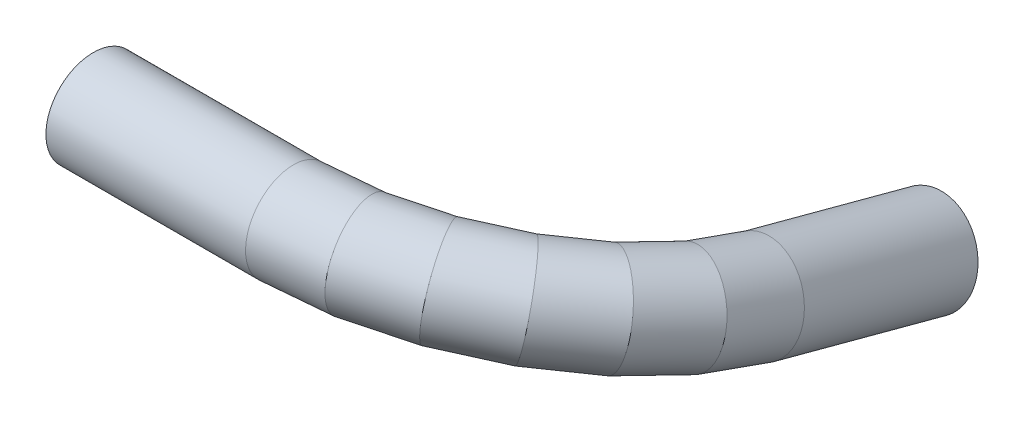
ISO-10303-21;
HEADER;
FILE_DESCRIPTION(('STEP AP214'),'2;1');
FILE_NAME('part.step','',(''),(''),'','','');
FILE_SCHEMA(('AUTOMOTIVE_DESIGN { 1 0 10303 214 1 1 1 1 }'));
ENDSEC;
DATA;
#1=APPLICATION_CONTEXT('core data for automotive mechanical design processes');
#2=APPLICATION_PROTOCOL_DEFINITION('international standard','automotive_design',2000,#1);
#3=PRODUCT_CONTEXT('',#1,'mechanical');
#4=PRODUCT('Part','Part','',(#3));
#5=PRODUCT_RELATED_PRODUCT_CATEGORY('part','',(#4));
#6=PRODUCT_DEFINITION_FORMATION('','',#4);
#7=PRODUCT_DEFINITION_CONTEXT('part definition',#1,'design');
#8=PRODUCT_DEFINITION('design','',#6,#7);
#9=PRODUCT_DEFINITION_SHAPE('','',#8);
#10=(LENGTH_UNIT() NAMED_UNIT(*) SI_UNIT(.MILLI.,.METRE.));
#11=(NAMED_UNIT(*) PLANE_ANGLE_UNIT() SI_UNIT($,.RADIAN.));
#12=(NAMED_UNIT(*) SI_UNIT($,.STERADIAN.) SOLID_ANGLE_UNIT());
#13=UNCERTAINTY_MEASURE_WITH_UNIT(LENGTH_MEASURE(1.E-05),#10,'distance_accuracy_value','');
#14=(GEOMETRIC_REPRESENTATION_CONTEXT(3) GLOBAL_UNCERTAINTY_ASSIGNED_CONTEXT((#13)) GLOBAL_UNIT_ASSIGNED_CONTEXT((#10,
#11,#12)) REPRESENTATION_CONTEXT('',''));
#15=CARTESIAN_POINT('',(0.,0.,0.));
#16=DIRECTION('',(0.,0.,1.));
#17=DIRECTION('',(1.,0.,0.));
#18=AXIS2_PLACEMENT_3D('',#15,#16,#17);
#19=CARTESIAN_POINT('',(-2155.08796047896,-28.4547197810884,-106.194459938157));
#20=DIRECTION('',(0.,-0.258819045102521,-0.965925826289068));
#21=DIRECTION('',(0.,0.965925826289068,-0.258819045102521));
#22=AXIS2_PLACEMENT_3D('',#19,#20,#21);
#23=CYLINDRICAL_SURFACE('',#22,4.7625);
#24=CARTESIAN_POINT('',(-2155.08796047896,-28.6124454360837,-106.783100096256));
#25=DIRECTION('',(0.0654031292301039,-0.258264893659645,-0.963857704949171));
#26=DIRECTION('',(0.997858923238606,0.0169275754540564,0.0631745716434777));
#27=AXIS2_PLACEMENT_3D('',#24,#25,#26);
#28=ELLIPSE('',#27,4.77271875721976,4.7625);
#29=CARTESIAN_POINT('',(-2150.32546047896,-28.5316548791999,-106.481585633194));
#30=VERTEX_POINT('',#29);
#31=EDGE_CURVE('E45',#30,#30,#28,.F.);
#32=ORIENTED_EDGE('',*,*,#31,.F.);
#33=EDGE_LOOP('',(#32));
#34=FACE_BOUND('',#33,.T.);
#35=CARTESIAN_POINT('',(-2155.08796047896,-33.2194244389083,-123.976579804201));
#36=DIRECTION('',(0.,-0.258819045102521,-0.965925826289069));
#37=DIRECTION('',(-0.965925826289069,0.25,-0.0669872981077807));
#38=AXIS2_PLACEMENT_3D('',#35,#36,#37);
#39=CIRCLE('',#38,4.7625);
#40=CARTESIAN_POINT('',(-2159.68818222666,-32.0287994389084,-124.29560681144));
#41=VERTEX_POINT('',#40);
#42=EDGE_CURVE('E80',#41,#41,#39,.T.);
#43=ORIENTED_EDGE('',*,*,#42,.F.);
#44=EDGE_LOOP('',(#43));
#45=FACE_BOUND('',#44,.T.);
#46=ADVANCED_FACE('F39',(#34,#45),#23,.T.);
#47=CARTESIAN_POINT('',(-2156.05234843799,-26.7165302408601,-99.70744826084));
#48=DIRECTION('',(0.130526192219974,-0.256604812292573,-0.957662196942559));
#49=DIRECTION('',(0.,0.965925826289068,-0.25881904510252));
#50=AXIS2_PLACEMENT_3D('',#47,#48,#49);
#51=CYLINDRICAL_SURFACE('',#50,4.7625);
#52=CARTESIAN_POINT('',(-2155.90574064802,-27.0047502814969,-100.783100096256));
#53=DIRECTION('',(0.258819045102512,-0.25,-0.933012701892222));
#54=DIRECTION('',(0.965925826289071,0.0669872981077807,0.249999999999991));
#55=AXIS2_PLACEMENT_3D('',#52,#53,#54);
#56=ELLIPSE('',#55,4.80359542476302,4.7625);
#57=CARTESIAN_POINT('',(-2151.2658237682,-26.6829704027891,-99.5822012400656));
#58=VERTEX_POINT('',#57);
#59=EDGE_CURVE('E94',#58,#58,#56,.F.);
#60=ORIENTED_EDGE('',*,*,#59,.F.);
#61=EDGE_LOOP('',(#60));
#62=FACE_BOUND('',#61,.T.);
#63=ORIENTED_EDGE('',*,*,#31,.T.);
#64=EDGE_LOOP('',(#63));
#65=FACE_BOUND('',#64,.T.);
#66=ADVANCED_FACE('F101',(#62,#65),#51,.T.);
#67=CARTESIAN_POINT('',(-2158.73318307944,-25.2380385736799,-94.1896422403565));
#68=DIRECTION('',(0.382683432365146,-0.239117618394328,-0.8923991008325));
#69=DIRECTION('',(-0.919060484937409,0.,-0.394116511994377));
#70=AXIS2_PLACEMENT_3D('',#67,#68,#69);
#71=CYLINDRICAL_SURFACE('',#70,4.7625);
#72=CARTESIAN_POINT('',(-2158.30335078813,-25.5066168948535,-95.1919901807875));
#73=DIRECTION('',(0.500000000000024,-0.22414386804201,-0.836516303737795));
#74=DIRECTION('',(0.866025403784425,0.12940952255126,0.482962913144559));
#75=AXIS2_PLACEMENT_3D('',#72,#73,#74);
#76=ELLIPSE('',#75,4.80359542476296,4.7625);
#77=CARTESIAN_POINT('',(-2154.14331512078,-24.8849859044055,-92.8720317408761));
#78=VERTEX_POINT('',#77);
#79=EDGE_CURVE('E95',#78,#78,#76,.F.);
#80=ORIENTED_EDGE('',*,*,#79,.F.);
#81=EDGE_LOOP('',(#80));
#82=FACE_BOUND('',#81,.T.);
#83=ORIENTED_EDGE('',*,*,#59,.T.);
#84=EDGE_LOOP('',(#83));
#85=FACE_BOUND('',#84,.T.);
#86=ADVANCED_FACE('F251',(#82,#85),#71,.T.);
#87=CARTESIAN_POINT('',(-2162.8011621628,-23.9895071577015,-89.5300595610788));
#88=DIRECTION('',(0.608761429008715,-0.205334953963075,-0.766320480760008));
#89=DIRECTION('',(-0.783004939700821,0.,-0.622015485662628));
#90=AXIS2_PLACEMENT_3D('',#87,#88,#89);
#91=CYLINDRICAL_SURFACE('',#90,4.7625);
#92=CARTESIAN_POINT('',(-2162.11739773048,-24.2201405906704,-90.3907952508431));
#93=DIRECTION('',(0.70710678118655,-0.183012701892219,-0.683012701892217));
#94=DIRECTION('',(0.707106781186545,0.183012701892223,0.683012701892221));
#95=AXIS2_PLACEMENT_3D('',#92,#93,#94);
#96=ELLIPSE('',#95,4.80359542476299,4.7625);
#97=CARTESIAN_POINT('',(-2158.72074283155,-23.3410216131874,-87.1098785609786));
#98=VERTEX_POINT('',#97);
#99=EDGE_CURVE('E90',#98,#98,#96,.F.);
#100=ORIENTED_EDGE('',*,*,#99,.F.);
#101=EDGE_LOOP('',(#100));
#102=FACE_BOUND('',#101,.T.);
#103=ORIENTED_EDGE('',*,*,#79,.T.);
#104=EDGE_LOOP('',(#103));
#105=FACE_BOUND('',#104,.T.);
#106=ADVANCED_FACE('F241',(#102,#105),#91,.T.);
#107=CARTESIAN_POINT('',(-2167.9790596362,-23.0560213456281,-86.0462430822764));
#108=DIRECTION('',(0.793353340291244,-0.15755905175128,-0.588018386328152));
#109=DIRECTION('',(-0.595455888114245,0.,-0.803388004210964));
#110=AXIS2_PLACEMENT_3D('',#107,#108,#109);
#111=CYLINDRICAL_SURFACE('',#110,4.7625);
#112=CARTESIAN_POINT('',(-2167.08796047896,-23.2329926030755,-86.7067088065491));
#113=DIRECTION('',(0.866025403784437,-0.129409522551261,-0.482962913144537));
#114=DIRECTION('',(0.500000000000003,0.224143868042014,0.836516303737806));
#115=AXIS2_PLACEMENT_3D('',#112,#113,#114);
#116=ELLIPSE('',#115,4.80359542476297,4.7625);
#117=CARTESIAN_POINT('',(-2164.68616276658,-22.1562961440602,-82.6884229171746));
#118=VERTEX_POINT('',#117);
#119=EDGE_CURVE('E88',#118,#118,#116,.F.);
#120=ORIENTED_EDGE('',*,*,#119,.F.);
#121=EDGE_LOOP('',(#120));
#122=FACE_BOUND('',#121,.T.);
#123=ORIENTED_EDGE('',*,*,#99,.T.);
#124=EDGE_LOOP('',(#123));
#125=FACE_BOUND('',#124,.T.);
#126=ADVANCED_FACE('F234',(#122,#125),#111,.T.);
#127=CARTESIAN_POINT('',(-2173.91401034371,-22.5011966528943,-83.9756091396997));
#128=DIRECTION('',(0.923879532511279,-0.0990457605412923,-0.369643810614405));
#129=DIRECTION('',(-0.371470375165584,0.,-0.928444807392631));
#130=AXIS2_PLACEMENT_3D('',#127,#128,#129);
#131=CYLINDRICAL_SURFACE('',#130,4.7625);
#132=CARTESIAN_POINT('',(-2172.8763033965,-22.6124454360837,-84.3907952508433));
#133=DIRECTION('',(0.965925826289067,-0.0669872981077821,-0.250000000000006));
#134=DIRECTION('',(0.258819045102527,0.249999999999999,0.933012701892218));
#135=AXIS2_PLACEMENT_3D('',#132,#133,#134);
#136=ELLIPSE('',#135,4.80359542476299,4.7625);
#137=CARTESIAN_POINT('',(-2171.6330414156,-21.4115465798929,-79.9089797047881));
#138=VERTEX_POINT('',#137);
#139=EDGE_CURVE('E82',#138,#138,#136,.F.);
#140=ORIENTED_EDGE('',*,*,#139,.F.);
#141=EDGE_LOOP('',(#140));
#142=FACE_BOUND('',#141,.T.);
#143=ORIENTED_EDGE('',*,*,#119,.T.);
#144=EDGE_LOOP('',(#143));
#145=FACE_BOUND('',#144,.T.);
#146=ADVANCED_FACE('F227',(#142,#145),#131,.T.);
#147=CARTESIAN_POINT('',(-2179.69215206807,-22.3802010244612,-83.5240473068944));
#148=DIRECTION('',(0.991444861373811,-0.0337826644312598,-0.126078620072512));
#149=DIRECTION('',(-0.126150626485876,0.,-0.992011098444579));
#150=AXIS2_PLACEMENT_3D('',#147,#148,#149);
#151=CYLINDRICAL_SURFACE('',#150,4.7625);
#152=CARTESIAN_POINT('',(-2179.08796047896,-22.4007883536232,-83.6008802653189));
#153=DIRECTION('',(0.997858923238604,-0.0169275754540614,-0.0631745716435129));
#154=DIRECTION('',(0.0654031292301392,0.258264893659644,0.963857704949168));
#155=AXIS2_PLACEMENT_3D('',#152,#153,#154);
#156=ELLIPSE('',#155,4.77271875721977,4.7625);
#157=CARTESIAN_POINT('',(-2178.7758097373,-21.1681626513224,-79.0006585176172));
#158=VERTEX_POINT('',#157);
#159=EDGE_CURVE('E78',#158,#158,#156,.F.);
#160=ORIENTED_EDGE('',*,*,#159,.F.);
#161=EDGE_LOOP('',(#160));
#162=FACE_BOUND('',#161,.T.);
#163=ORIENTED_EDGE('',*,*,#139,.T.);
#164=EDGE_LOOP('',(#163));
#165=FACE_BOUND('',#164,.T.);
#166=ADVANCED_FACE('F118',(#162,#165),#151,.T.);
#167=CARTESIAN_POINT('',(-2198.88796047896,-22.4007883536232,-83.6008802653189));
#168=DIRECTION('',(1.,0.,0.));
#169=DIRECTION('',(0.,0.,-1.));
#170=AXIS2_PLACEMENT_3D('',#167,#168,#169);
#171=CYLINDRICAL_SURFACE('',#170,4.7625);
#172=CARTESIAN_POINT('',(-2198.88796047896,-22.4007883536232,-83.6008802653189));
#173=DIRECTION('',(1.,0.,0.));
#174=DIRECTION('',(0.,0.,-1.));
#175=AXIS2_PLACEMENT_3D('',#172,#173,#174);
#176=CIRCLE('',#175,4.7625);
#177=CARTESIAN_POINT('',(-2198.88796047896,-22.4007883536232,-88.3633802653189));
#178=VERTEX_POINT('',#177);
#179=EDGE_CURVE('E74',#178,#178,#176,.T.);
#180=ORIENTED_EDGE('',*,*,#179,.T.);
#181=EDGE_LOOP('',(#180));
#182=FACE_BOUND('',#181,.T.);
#183=ORIENTED_EDGE('',*,*,#159,.T.);
#184=EDGE_LOOP('',(#183));
#185=FACE_BOUND('',#184,.T.);
#186=ADVANCED_FACE('F109',(#182,#185),#171,.T.);
#187=CARTESIAN_POINT('',(-2155.08796047896,-33.2194244389083,-123.976579804201));
#188=DIRECTION('',(0.,-0.258819045102521,-0.965925826289069));
#189=DIRECTION('',(-0.965925826289069,0.25,-0.0669872981077807));
#190=AXIS2_PLACEMENT_3D('',#187,#188,#189);
#191=PLANE('',#190);
#192=CARTESIAN_POINT('',(-2155.08796047896,-33.2194244389083,-123.976579804201));
#193=DIRECTION('',(0.,-0.258819045102521,-0.965925826289069));
#194=DIRECTION('',(-0.965925826289069,0.25,-0.0669872981077807));
#195=AXIS2_PLACEMENT_3D('',#192,#193,#194);
#196=CIRCLE('',#195,3.8735);
#197=CARTESIAN_POINT('',(-2158.82947416709,-32.2510494389084,-124.236055103422));
#198=VERTEX_POINT('',#197);
#199=EDGE_CURVE('E72',#198,#198,#196,.F.);
#200=ORIENTED_EDGE('',*,*,#199,.T.);
#201=EDGE_LOOP('',(#200));
#202=FACE_BOUND('',#201,.T.);
#203=ORIENTED_EDGE('',*,*,#42,.T.);
#204=EDGE_LOOP('',(#203));
#205=FACE_BOUND('',#204,.T.);
#206=ADVANCED_FACE('F110',(#202,#205),#191,.T.);
#207=CARTESIAN_POINT('',(-2198.88796047896,-22.4007883536232,-83.6008802653189));
#208=DIRECTION('',(1.,0.,0.));
#209=DIRECTION('',(0.,0.,-1.));
#210=AXIS2_PLACEMENT_3D('',#207,#208,#209);
#211=PLANE('',#210);
#212=CARTESIAN_POINT('',(-2198.88796047896,-22.4007883536232,-83.6008802653189));
#213=DIRECTION('',(1.,0.,0.));
#214=DIRECTION('',(0.,0.,-1.));
#215=AXIS2_PLACEMENT_3D('',#212,#213,#214);
#216=CIRCLE('',#215,3.8735);
#217=CARTESIAN_POINT('',(-2198.88796047896,-22.4007883536232,-87.4743802653189));
#218=VERTEX_POINT('',#217);
#219=EDGE_CURVE('E46',#218,#218,#216,.F.);
#220=ORIENTED_EDGE('',*,*,#219,.F.);
#221=EDGE_LOOP('',(#220));
#222=FACE_BOUND('',#221,.T.);
#223=ORIENTED_EDGE('',*,*,#179,.F.);
#224=EDGE_LOOP('',(#223));
#225=FACE_BOUND('',#224,.T.);
#226=ADVANCED_FACE('F108',(#222,#225),#211,.F.);
#227=CARTESIAN_POINT('',(-2155.08796047896,-28.4793306145122,-106.286308818912));
#228=DIRECTION('',(0.,-0.258819045102521,-0.965925826289068));
#229=DIRECTION('',(0.,0.965925826289068,-0.258819045102521));
#230=AXIS2_PLACEMENT_3D('',#227,#228,#229);
#231=CYLINDRICAL_SURFACE('',#230,3.8735);
#232=CARTESIAN_POINT('',(-2155.08796047896,-28.6124454360837,-106.783100096256));
#233=DIRECTION('',(0.0654031292301039,-0.258264893659645,-0.963857704949171));
#234=DIRECTION('',(0.997858923238606,0.0169275754540559,0.0631745716434779));
#235=AXIS2_PLACEMENT_3D('',#232,#233,#234);
#236=ELLIPSE('',#235,3.88181125587207,3.8735);
#237=CARTESIAN_POINT('',(-2151.21446047896,-28.5467357831515,-106.537868332966));
#238=VERTEX_POINT('',#237);
#239=EDGE_CURVE('E67',#238,#238,#236,.T.);
#240=ORIENTED_EDGE('',*,*,#239,.F.);
#241=EDGE_LOOP('',(#240));
#242=FACE_BOUND('',#241,.T.);
#243=ORIENTED_EDGE('',*,*,#199,.F.);
#244=EDGE_LOOP('',(#243));
#245=FACE_BOUND('',#244,.T.);
#246=ADVANCED_FACE('F120',(#242,#245),#231,.F.);
#247=CARTESIAN_POINT('',(-2156.02741813945,-26.7655413586161,-99.890360242441));
#248=DIRECTION('',(0.130526192219974,-0.256604812292573,-0.957662196942559));
#249=DIRECTION('',(0.,0.965925826289068,-0.25881904510252));
#250=AXIS2_PLACEMENT_3D('',#247,#248,#249);
#251=CYLINDRICAL_SURFACE('',#250,3.8735);
#252=CARTESIAN_POINT('',(-2155.90574064802,-27.0047502814969,-100.783100096256));
#253=DIRECTION('',(0.258819045102512,-0.25,-0.933012701892222));
#254=DIRECTION('',(0.965925826289071,0.0669872981077805,0.249999999999992));
#255=AXIS2_PLACEMENT_3D('',#252,#253,#254);
#256=ELLIPSE('',#255,3.90692427880726,3.8735);
#257=CARTESIAN_POINT('',(-2152.13194158576,-26.7430359801479,-99.8063690265546));
#258=VERTEX_POINT('',#257);
#259=EDGE_CURVE('E63',#258,#258,#256,.T.);
#260=ORIENTED_EDGE('',*,*,#259,.F.);
#261=EDGE_LOOP('',(#260));
#262=FACE_BOUND('',#261,.T.);
#263=ORIENTED_EDGE('',*,*,#239,.T.);
#264=EDGE_LOOP('',(#263));
#265=FACE_BOUND('',#264,.T.);
#266=ADVANCED_FACE('F149',(#262,#265),#251,.F.);
#267=CARTESIAN_POINT('',(-2158.66009114246,-25.2837096647557,-94.3600890726883));
#268=DIRECTION('',(0.382683432365146,-0.239117618394328,-0.892399100832501));
#269=DIRECTION('',(-0.919060484937409,0.,-0.394116511994377));
#270=AXIS2_PLACEMENT_3D('',#267,#268,#269);
#271=CYLINDRICAL_SURFACE('',#270,3.8735);
#272=CARTESIAN_POINT('',(-2158.30335078813,-25.5066168948534,-95.1919901807874));
#273=DIRECTION('',(0.500000000000024,-0.22414386804201,-0.836516303737795));
#274=DIRECTION('',(0.866025403784425,0.12940952255126,0.482962913144559));
#275=AXIS2_PLACEMENT_3D('',#272,#273,#274);
#276=ELLIPSE('',#275,3.90692427880721,3.8735);
#277=CARTESIAN_POINT('',(-2154.91985511202,-25.0010236892891,-93.3050906496595));
#278=VERTEX_POINT('',#277);
#279=EDGE_CURVE('E65',#278,#278,#276,.T.);
#280=ORIENTED_EDGE('',*,*,#279,.F.);
#281=EDGE_LOOP('',(#280));
#282=FACE_BOUND('',#281,.T.);
#283=ORIENTED_EDGE('',*,*,#259,.T.);
#284=EDGE_LOOP('',(#283));
#285=FACE_BOUND('',#284,.T.);
#286=ADVANCED_FACE('F144',(#282,#285),#271,.F.);
#287=CARTESIAN_POINT('',(-2162.68488968211,-24.028725812715,-89.676425574194));
#288=DIRECTION('',(0.608761429008715,-0.205334953963075,-0.766320480760008));
#289=DIRECTION('',(-0.783004939700821,0.,-0.622015485662627));
#290=AXIS2_PLACEMENT_3D('',#287,#288,#289);
#291=CYLINDRICAL_SURFACE('',#290,3.8735);
#292=CARTESIAN_POINT('',(-2162.11739773048,-24.2201405906705,-90.3907952508433));
#293=DIRECTION('',(0.70710678118655,-0.183012701892219,-0.683012701892217));
#294=DIRECTION('',(0.707106781186545,0.183012701892223,0.683012701892221));
#295=AXIS2_PLACEMENT_3D('',#292,#293,#294);
#296=ELLIPSE('',#295,3.90692427880723,3.8735);
#297=CARTESIAN_POINT('',(-2159.35478507935,-23.5051238223176,-87.7223163430869));
#298=VERTEX_POINT('',#297);
#299=EDGE_CURVE('E56',#298,#298,#296,.T.);
#300=ORIENTED_EDGE('',*,*,#299,.F.);
#301=EDGE_LOOP('',(#300));
#302=FACE_BOUND('',#301,.T.);
#303=ORIENTED_EDGE('',*,*,#279,.T.);
#304=EDGE_LOOP('',(#303));
#305=FACE_BOUND('',#304,.T.);
#306=ADVANCED_FACE('F143',(#302,#305),#291,.F.);
#307=CARTESIAN_POINT('',(-2167.8275303892,-23.0861148780522,-86.1585536742624));
#308=DIRECTION('',(0.793353340291244,-0.15755905175128,-0.588018386328152));
#309=DIRECTION('',(-0.595455888114245,0.,-0.803388004210964));
#310=AXIS2_PLACEMENT_3D('',#307,#308,#309);
#311=CYLINDRICAL_SURFACE('',#310,3.8735);
#312=CARTESIAN_POINT('',(-2167.08796047896,-23.2329926030755,-86.7067088065491));
#313=DIRECTION('',(0.866025403784437,-0.129409522551261,-0.482962913144537));
#314=DIRECTION('',(0.500000000000003,0.224143868042014,0.836516303737806));
#315=AXIS2_PLACEMENT_3D('',#312,#313,#314);
#316=ELLIPSE('',#315,3.90692427880722,3.8735);
#317=CARTESIAN_POINT('',(-2165.13449833956,-22.3572794830764,-83.4385029498578));
#318=VERTEX_POINT('',#317);
#319=EDGE_CURVE('E57',#318,#318,#316,.T.);
#320=ORIENTED_EDGE('',*,*,#319,.F.);
#321=EDGE_LOOP('',(#320));
#322=FACE_BOUND('',#321,.T.);
#323=ORIENTED_EDGE('',*,*,#299,.T.);
#324=EDGE_LOOP('',(#323));
#325=FACE_BOUND('',#324,.T.);
#326=ADVANCED_FACE('F140',(#322,#325),#311,.F.);
#327=CARTESIAN_POINT('',(-2173.73755079817,-22.5201142382262,-84.046210529315));
#328=DIRECTION('',(0.923879532511279,-0.0990457605412923,-0.369643810614405));
#329=DIRECTION('',(-0.371470375165584,0.,-0.928444807392631));
#330=AXIS2_PLACEMENT_3D('',#327,#328,#329);
#331=CYLINDRICAL_SURFACE('',#330,3.8735);
#332=CARTESIAN_POINT('',(-2172.8763033965,-22.6124454360837,-84.3907952508433));
#333=DIRECTION('',(0.965925826289067,-0.0669872981077821,-0.250000000000006));
#334=DIRECTION('',(0.258819045102527,0.249999999999999,0.933012701892218));
#335=AXIS2_PLACEMENT_3D('',#332,#333,#334);
#336=ELLIPSE('',#335,3.90692427880723,3.8735);
#337=CARTESIAN_POINT('',(-2171.86511698537,-21.6357143663819,-80.7455852733851));
#338=VERTEX_POINT('',#337);
#339=EDGE_CURVE('E51',#338,#338,#336,.T.);
#340=ORIENTED_EDGE('',*,*,#339,.F.);
#341=EDGE_LOOP('',(#340));
#342=FACE_BOUND('',#341,.T.);
#343=ORIENTED_EDGE('',*,*,#319,.T.);
#344=EDGE_LOOP('',(#343));
#345=FACE_BOUND('',#344,.T.);
#346=ADVANCED_FACE('F132',(#342,#345),#331,.F.);
#347=CARTESIAN_POINT('',(-2179.59787660885,-22.3834133828354,-83.536035991559));
#348=DIRECTION('',(0.991444861373811,-0.0337826644312598,-0.126078620072512));
#349=DIRECTION('',(-0.126150626485876,0.,-0.992011098444579));
#350=AXIS2_PLACEMENT_3D('',#347,#348,#349);
#351=CYLINDRICAL_SURFACE('',#350,3.8735);
#352=CARTESIAN_POINT('',(-2179.08796047896,-22.4007883536232,-83.6008802653189));
#353=DIRECTION('',(0.997858923238604,-0.0169275754540614,-0.0631745716435129));
#354=DIRECTION('',(0.0654031292301392,0.258264893659644,0.963857704949168));
#355=AXIS2_PLACEMENT_3D('',#352,#353,#354);
#356=ELLIPSE('',#355,3.88181125587208,3.8735);
#357=CARTESIAN_POINT('',(-2178.83407787574,-21.3982527824185,-79.8593665771882));
#358=VERTEX_POINT('',#357);
#359=EDGE_CURVE('E10',#358,#358,#356,.T.);
#360=ORIENTED_EDGE('',*,*,#359,.F.);
#361=EDGE_LOOP('',(#360));
#362=FACE_BOUND('',#361,.T.);
#363=ORIENTED_EDGE('',*,*,#339,.T.);
#364=EDGE_LOOP('',(#363));
#365=FACE_BOUND('',#364,.T.);
#366=ADVANCED_FACE('F124',(#362,#365),#351,.F.);
#367=CARTESIAN_POINT('',(-2198.88796047896,-22.4007883536232,-83.6008802653189));
#368=DIRECTION('',(1.,0.,0.));
#369=DIRECTION('',(0.,0.,-1.));
#370=AXIS2_PLACEMENT_3D('',#367,#368,#369);
#371=CYLINDRICAL_SURFACE('',#370,3.8735);
#372=ORIENTED_EDGE('',*,*,#219,.T.);
#373=EDGE_LOOP('',(#372));
#374=FACE_BOUND('',#373,.T.);
#375=ORIENTED_EDGE('',*,*,#359,.T.);
#376=EDGE_LOOP('',(#375));
#377=FACE_BOUND('',#376,.T.);
#378=ADVANCED_FACE('F122',(#374,#377),#371,.F.);
#379=CLOSED_SHELL('',(#46,#66,#86,#106,#126,#146,#166,#186,#206,#226,#246,#266,#286,#306,#326,
#346,#366,#378));
#380=MANIFOLD_SOLID_BREP('B2',#379);
#381=ADVANCED_BREP_SHAPE_REPRESENTATION('',(#18,#380),#14);
#382=SHAPE_DEFINITION_REPRESENTATION(#9,#381);
ENDSEC;
END-ISO-10303-21;
